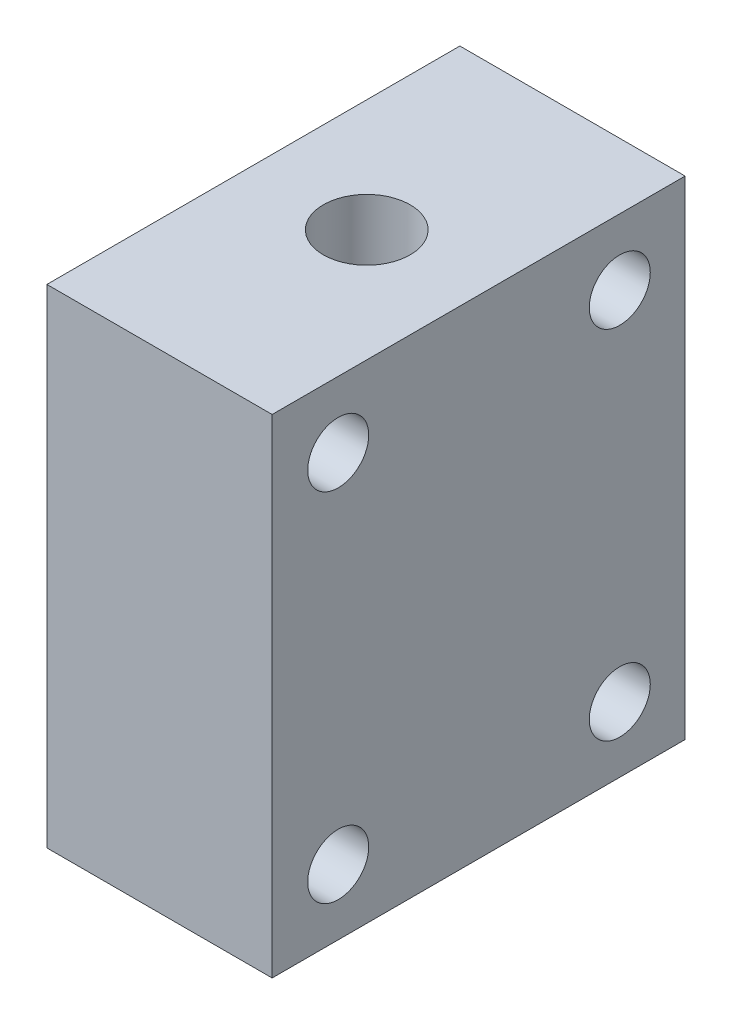
ISO-10303-21;
HEADER;
FILE_DESCRIPTION(('STEP AP214'),'2;1');
FILE_NAME('part.step','',(''),(''),'','','');
FILE_SCHEMA(('AUTOMOTIVE_DESIGN { 1 0 10303 214 1 1 1 1 }'));
ENDSEC;
DATA;
#1=APPLICATION_CONTEXT('core data for automotive mechanical design processes');
#2=APPLICATION_PROTOCOL_DEFINITION('international standard','automotive_design',2000,#1);
#3=PRODUCT_CONTEXT('',#1,'mechanical');
#4=PRODUCT('Part','Part','',(#3));
#5=PRODUCT_RELATED_PRODUCT_CATEGORY('part','',(#4));
#6=PRODUCT_DEFINITION_FORMATION('','',#4);
#7=PRODUCT_DEFINITION_CONTEXT('part definition',#1,'design');
#8=PRODUCT_DEFINITION('design','',#6,#7);
#9=PRODUCT_DEFINITION_SHAPE('','',#8);
#10=(LENGTH_UNIT() NAMED_UNIT(*) SI_UNIT(.MILLI.,.METRE.));
#11=(NAMED_UNIT(*) PLANE_ANGLE_UNIT() SI_UNIT($,.RADIAN.));
#12=(NAMED_UNIT(*) SI_UNIT($,.STERADIAN.) SOLID_ANGLE_UNIT());
#13=UNCERTAINTY_MEASURE_WITH_UNIT(LENGTH_MEASURE(1.E-05),#10,'distance_accuracy_value','');
#14=(GEOMETRIC_REPRESENTATION_CONTEXT(3) GLOBAL_UNCERTAINTY_ASSIGNED_CONTEXT((#13)) GLOBAL_UNIT_ASSIGNED_CONTEXT((#10,
#11,#12)) REPRESENTATION_CONTEXT('',''));
#15=CARTESIAN_POINT('',(0.,0.,0.));
#16=DIRECTION('',(0.,0.,1.));
#17=DIRECTION('',(1.,0.,0.));
#18=AXIS2_PLACEMENT_3D('',#15,#16,#17);
#19=CARTESIAN_POINT('',(38.1,0.,0.));
#20=DIRECTION('',(0.,1.,0.));
#21=DIRECTION('',(0.,0.,1.));
#22=AXIS2_PLACEMENT_3D('',#19,#20,#21);
#23=PLANE('',#22);
#24=DIRECTION('',(0.,0.,-1.));
#25=VECTOR('',#24,1.);
#26=CARTESIAN_POINT('',(0.,0.,0.));
#27=LINE('',#26,#25);
#28=CARTESIAN_POINT('',(0.,0.,69.85));
#29=VERTEX_POINT('',#28);
#30=CARTESIAN_POINT('',(0.,0.,0.));
#31=VERTEX_POINT('',#30);
#32=EDGE_CURVE('E181',#29,#31,#27,.T.);
#33=ORIENTED_EDGE('',*,*,#32,.T.);
#34=DIRECTION('',(-1.,0.,0.));
#35=VECTOR('',#34,1.);
#36=CARTESIAN_POINT('',(38.1,0.,0.));
#37=LINE('',#36,#35);
#38=CARTESIAN_POINT('',(38.1,0.,0.));
#39=VERTEX_POINT('',#38);
#40=EDGE_CURVE('E210',#39,#31,#37,.T.);
#41=ORIENTED_EDGE('',*,*,#40,.F.);
#42=DIRECTION('',(0.,0.,-1.));
#43=VECTOR('',#42,1.);
#44=CARTESIAN_POINT('',(38.1,0.,0.));
#45=LINE('',#44,#43);
#46=CARTESIAN_POINT('',(38.1,0.,69.85));
#47=VERTEX_POINT('',#46);
#48=EDGE_CURVE('E184',#47,#39,#45,.T.);
#49=ORIENTED_EDGE('',*,*,#48,.F.);
#50=DIRECTION('',(-1.,0.,0.));
#51=VECTOR('',#50,1.);
#52=CARTESIAN_POINT('',(38.1,0.,69.85));
#53=LINE('',#52,#51);
#54=EDGE_CURVE('E194',#47,#29,#53,.T.);
#55=ORIENTED_EDGE('',*,*,#54,.T.);
#56=EDGE_LOOP('',(#33,#41,#49,#55));
#57=FACE_BOUND('',#56,.T.);
#58=ADVANCED_FACE('F43',(#57),#23,.F.);
#59=CARTESIAN_POINT('',(38.1,0.,0.));
#60=DIRECTION('',(0.,0.,1.));
#61=DIRECTION('',(1.,0.,0.));
#62=AXIS2_PLACEMENT_3D('',#59,#60,#61);
#63=PLANE('',#62);
#64=DIRECTION('',(0.,1.,0.));
#65=VECTOR('',#64,1.);
#66=CARTESIAN_POINT('',(0.,0.,0.));
#67=LINE('',#66,#65);
#68=CARTESIAN_POINT('',(0.,82.55,0.));
#69=VERTEX_POINT('',#68);
#70=EDGE_CURVE('E197',#31,#69,#67,.T.);
#71=ORIENTED_EDGE('',*,*,#70,.T.);
#72=DIRECTION('',(-1.,0.,0.));
#73=VECTOR('',#72,1.);
#74=CARTESIAN_POINT('',(38.1,82.55,0.));
#75=LINE('',#74,#73);
#76=CARTESIAN_POINT('',(38.1,82.55,0.));
#77=VERTEX_POINT('',#76);
#78=EDGE_CURVE('E207',#77,#69,#75,.T.);
#79=ORIENTED_EDGE('',*,*,#78,.F.);
#80=DIRECTION('',(0.,1.,0.));
#81=VECTOR('',#80,1.);
#82=CARTESIAN_POINT('',(38.1,0.,0.));
#83=LINE('',#82,#81);
#84=EDGE_CURVE('E187',#39,#77,#83,.T.);
#85=ORIENTED_EDGE('',*,*,#84,.F.);
#86=ORIENTED_EDGE('',*,*,#40,.T.);
#87=EDGE_LOOP('',(#71,#79,#85,#86));
#88=FACE_BOUND('',#87,.T.);
#89=ADVANCED_FACE('F237',(#88),#63,.F.);
#90=CARTESIAN_POINT('',(38.1,82.55,0.));
#91=DIRECTION('',(0.,-1.,0.));
#92=DIRECTION('',(0.,0.,-1.));
#93=AXIS2_PLACEMENT_3D('',#90,#91,#92);
#94=PLANE('',#93);
#95=CARTESIAN_POINT('',(19.05,82.55,34.798));
#96=DIRECTION('',(0.,1.,0.));
#97=DIRECTION('',(0.,0.,1.));
#98=AXIS2_PLACEMENT_3D('',#95,#96,#97);
#99=CIRCLE('',#98,7.3421875);
#100=CARTESIAN_POINT('',(19.05,82.55,42.1401875));
#101=VERTEX_POINT('',#100);
#102=EDGE_CURVE('E227',#101,#101,#99,.T.);
#103=ORIENTED_EDGE('',*,*,#102,.F.);
#104=EDGE_LOOP('',(#103));
#105=FACE_BOUND('',#104,.T.);
#106=DIRECTION('',(0.,0.,1.));
#107=VECTOR('',#106,1.);
#108=CARTESIAN_POINT('',(0.,82.55,0.));
#109=LINE('',#108,#107);
#110=CARTESIAN_POINT('',(0.,82.55,69.85));
#111=VERTEX_POINT('',#110);
#112=EDGE_CURVE('E199',#69,#111,#109,.T.);
#113=ORIENTED_EDGE('',*,*,#112,.T.);
#114=DIRECTION('',(-1.,0.,0.));
#115=VECTOR('',#114,1.);
#116=CARTESIAN_POINT('',(38.1,82.55,69.85));
#117=LINE('',#116,#115);
#118=CARTESIAN_POINT('',(38.1,82.55,69.85));
#119=VERTEX_POINT('',#118);
#120=EDGE_CURVE('E204',#119,#111,#117,.T.);
#121=ORIENTED_EDGE('',*,*,#120,.F.);
#122=DIRECTION('',(0.,0.,1.));
#123=VECTOR('',#122,1.);
#124=CARTESIAN_POINT('',(38.1,82.55,0.));
#125=LINE('',#124,#123);
#126=EDGE_CURVE('E190',#77,#119,#125,.T.);
#127=ORIENTED_EDGE('',*,*,#126,.F.);
#128=ORIENTED_EDGE('',*,*,#78,.T.);
#129=EDGE_LOOP('',(#113,#121,#127,#128));
#130=FACE_BOUND('',#129,.T.);
#131=ADVANCED_FACE('F233',(#105,#130),#94,.F.);
#132=CARTESIAN_POINT('',(38.1,0.,69.85));
#133=DIRECTION('',(0.,0.,-1.));
#134=DIRECTION('',(-1.,0.,0.));
#135=AXIS2_PLACEMENT_3D('',#132,#133,#134);
#136=PLANE('',#135);
#137=DIRECTION('',(0.,-1.,0.));
#138=VECTOR('',#137,1.);
#139=CARTESIAN_POINT('',(0.,0.,69.85));
#140=LINE('',#139,#138);
#141=EDGE_CURVE('E188',#111,#29,#140,.T.);
#142=ORIENTED_EDGE('',*,*,#141,.T.);
#143=ORIENTED_EDGE('',*,*,#54,.F.);
#144=DIRECTION('',(0.,-1.,0.));
#145=VECTOR('',#144,1.);
#146=CARTESIAN_POINT('',(38.1,0.,69.85));
#147=LINE('',#146,#145);
#148=EDGE_CURVE('E192',#119,#47,#147,.T.);
#149=ORIENTED_EDGE('',*,*,#148,.F.);
#150=ORIENTED_EDGE('',*,*,#120,.T.);
#151=EDGE_LOOP('',(#142,#143,#149,#150));
#152=FACE_BOUND('',#151,.T.);
#153=ADVANCED_FACE('F236',(#152),#136,.F.);
#154=CARTESIAN_POINT('',(38.1,0.,0.));
#155=DIRECTION('',(-1.,0.,0.));
#156=DIRECTION('',(0.,0.,1.));
#157=AXIS2_PLACEMENT_3D('',#154,#155,#156);
#158=PLANE('',#157);
#159=CARTESIAN_POINT('',(38.1,71.374,11.049));
#160=DIRECTION('',(1.,0.,0.));
#161=DIRECTION('',(0.,0.,-1.));
#162=AXIS2_PLACEMENT_3D('',#159,#160,#161);
#163=CIRCLE('',#162,5.15937499999999);
#164=CARTESIAN_POINT('',(38.1,71.374,5.88962500000001));
#165=VERTEX_POINT('',#164);
#166=EDGE_CURVE('E160',#165,#165,#163,.T.);
#167=ORIENTED_EDGE('',*,*,#166,.F.);
#168=EDGE_LOOP('',(#167));
#169=FACE_BOUND('',#168,.T.);
#170=CARTESIAN_POINT('',(38.1,11.049,58.674));
#171=DIRECTION('',(1.,0.,0.));
#172=DIRECTION('',(0.,0.,-1.));
#173=AXIS2_PLACEMENT_3D('',#170,#171,#172);
#174=CIRCLE('',#173,5.159375);
#175=CARTESIAN_POINT('',(38.1,11.049,53.514625));
#176=VERTEX_POINT('',#175);
#177=EDGE_CURVE('E170',#176,#176,#174,.T.);
#178=ORIENTED_EDGE('',*,*,#177,.F.);
#179=EDGE_LOOP('',(#178));
#180=FACE_BOUND('',#179,.T.);
#181=CARTESIAN_POINT('',(38.1,71.374,58.674));
#182=DIRECTION('',(1.,0.,0.));
#183=DIRECTION('',(0.,0.,-1.));
#184=AXIS2_PLACEMENT_3D('',#181,#182,#183);
#185=CIRCLE('',#184,5.15937499999999);
#186=CARTESIAN_POINT('',(38.1,71.374,53.514625));
#187=VERTEX_POINT('',#186);
#188=EDGE_CURVE('E159',#187,#187,#185,.T.);
#189=ORIENTED_EDGE('',*,*,#188,.F.);
#190=EDGE_LOOP('',(#189));
#191=FACE_BOUND('',#190,.T.);
#192=CARTESIAN_POINT('',(38.1,11.049,11.049));
#193=DIRECTION('',(1.,0.,0.));
#194=DIRECTION('',(0.,0.,-1.));
#195=AXIS2_PLACEMENT_3D('',#192,#193,#194);
#196=CIRCLE('',#195,5.159375);
#197=CARTESIAN_POINT('',(38.1,11.049,5.889625));
#198=VERTEX_POINT('',#197);
#199=EDGE_CURVE('E178',#198,#198,#196,.T.);
#200=ORIENTED_EDGE('',*,*,#199,.F.);
#201=EDGE_LOOP('',(#200));
#202=FACE_BOUND('',#201,.T.);
#203=ORIENTED_EDGE('',*,*,#48,.T.);
#204=ORIENTED_EDGE('',*,*,#84,.T.);
#205=ORIENTED_EDGE('',*,*,#126,.T.);
#206=ORIENTED_EDGE('',*,*,#148,.T.);
#207=EDGE_LOOP('',(#203,#204,#205,#206));
#208=FACE_BOUND('',#207,.T.);
#209=ADVANCED_FACE('F254',(#169,#180,#191,#202,#208),#158,.F.);
#210=CARTESIAN_POINT('',(0.,0.,0.));
#211=DIRECTION('',(-1.,0.,0.));
#212=DIRECTION('',(0.,0.,1.));
#213=AXIS2_PLACEMENT_3D('',#210,#211,#212);
#214=PLANE('',#213);
#215=CARTESIAN_POINT('',(0.,58.674,34.798));
#216=DIRECTION('',(1.,0.,0.));
#217=DIRECTION('',(0.,0.,-1.));
#218=AXIS2_PLACEMENT_3D('',#215,#216,#217);
#219=CIRCLE('',#218,12.7254);
#220=CARTESIAN_POINT('',(0.,58.674,22.0726));
#221=VERTEX_POINT('',#220);
#222=EDGE_CURVE('E136',#221,#221,#219,.T.);
#223=ORIENTED_EDGE('',*,*,#222,.T.);
#224=EDGE_LOOP('',(#223));
#225=FACE_BOUND('',#224,.T.);
#226=CARTESIAN_POINT('',(0.,23.622,34.798));
#227=DIRECTION('',(1.,0.,0.));
#228=DIRECTION('',(0.,0.,-1.));
#229=AXIS2_PLACEMENT_3D('',#226,#227,#228);
#230=CIRCLE('',#229,12.7254);
#231=CARTESIAN_POINT('',(0.,23.622,22.0726));
#232=VERTEX_POINT('',#231);
#233=EDGE_CURVE('E149',#232,#232,#230,.T.);
#234=ORIENTED_EDGE('',*,*,#233,.T.);
#235=EDGE_LOOP('',(#234));
#236=FACE_BOUND('',#235,.T.);
#237=CARTESIAN_POINT('',(0.,71.374,11.049));
#238=DIRECTION('',(1.,0.,0.));
#239=DIRECTION('',(0.,0.,-1.));
#240=AXIS2_PLACEMENT_3D('',#237,#238,#239);
#241=CIRCLE('',#240,5.15937499999999);
#242=CARTESIAN_POINT('',(0.,71.374,5.88962500000001));
#243=VERTEX_POINT('',#242);
#244=EDGE_CURVE('E164',#243,#243,#241,.T.);
#245=ORIENTED_EDGE('',*,*,#244,.T.);
#246=EDGE_LOOP('',(#245));
#247=FACE_BOUND('',#246,.T.);
#248=CARTESIAN_POINT('',(0.,11.049,58.674));
#249=DIRECTION('',(1.,0.,0.));
#250=DIRECTION('',(0.,0.,-1.));
#251=AXIS2_PLACEMENT_3D('',#248,#249,#250);
#252=CIRCLE('',#251,5.159375);
#253=CARTESIAN_POINT('',(0.,11.049,53.514625));
#254=VERTEX_POINT('',#253);
#255=EDGE_CURVE('E167',#254,#254,#252,.T.);
#256=ORIENTED_EDGE('',*,*,#255,.T.);
#257=EDGE_LOOP('',(#256));
#258=FACE_BOUND('',#257,.T.);
#259=CARTESIAN_POINT('',(0.,71.374,58.674));
#260=DIRECTION('',(1.,0.,0.));
#261=DIRECTION('',(0.,0.,-1.));
#262=AXIS2_PLACEMENT_3D('',#259,#260,#261);
#263=CIRCLE('',#262,5.15937499999999);
#264=CARTESIAN_POINT('',(0.,71.374,53.514625));
#265=VERTEX_POINT('',#264);
#266=EDGE_CURVE('E173',#265,#265,#263,.T.);
#267=ORIENTED_EDGE('',*,*,#266,.T.);
#268=EDGE_LOOP('',(#267));
#269=FACE_BOUND('',#268,.T.);
#270=CARTESIAN_POINT('',(0.,11.049,11.049));
#271=DIRECTION('',(1.,0.,0.));
#272=DIRECTION('',(0.,0.,-1.));
#273=AXIS2_PLACEMENT_3D('',#270,#271,#272);
#274=CIRCLE('',#273,5.159375);
#275=CARTESIAN_POINT('',(0.,11.049,5.889625));
#276=VERTEX_POINT('',#275);
#277=EDGE_CURVE('E163',#276,#276,#274,.T.);
#278=ORIENTED_EDGE('',*,*,#277,.T.);
#279=EDGE_LOOP('',(#278));
#280=FACE_BOUND('',#279,.T.);
#281=ORIENTED_EDGE('',*,*,#32,.F.);
#282=ORIENTED_EDGE('',*,*,#141,.F.);
#283=ORIENTED_EDGE('',*,*,#112,.F.);
#284=ORIENTED_EDGE('',*,*,#70,.F.);
#285=EDGE_LOOP('',(#281,#282,#283,#284));
#286=FACE_BOUND('',#285,.T.);
#287=ADVANCED_FACE('F249',(#225,#236,#247,#258,#269,#280,#286),#214,.T.);
#288=CARTESIAN_POINT('',(38.1,11.049,11.049));
#289=DIRECTION('',(-1.,0.,0.));
#290=DIRECTION('',(0.,0.,1.));
#291=AXIS2_PLACEMENT_3D('',#288,#289,#290);
#292=CYLINDRICAL_SURFACE('',#291,5.159375);
#293=ORIENTED_EDGE('',*,*,#199,.T.);
#294=EDGE_LOOP('',(#293));
#295=FACE_BOUND('',#294,.T.);
#296=ORIENTED_EDGE('',*,*,#277,.F.);
#297=EDGE_LOOP('',(#296));
#298=FACE_BOUND('',#297,.T.);
#299=ADVANCED_FACE('F265',(#295,#298),#292,.F.);
#300=CARTESIAN_POINT('',(38.1,71.374,58.674));
#301=DIRECTION('',(-1.,0.,0.));
#302=DIRECTION('',(0.,0.,1.));
#303=AXIS2_PLACEMENT_3D('',#300,#301,#302);
#304=CYLINDRICAL_SURFACE('',#303,5.15937499999999);
#305=ORIENTED_EDGE('',*,*,#188,.T.);
#306=EDGE_LOOP('',(#305));
#307=FACE_BOUND('',#306,.T.);
#308=ORIENTED_EDGE('',*,*,#266,.F.);
#309=EDGE_LOOP('',(#308));
#310=FACE_BOUND('',#309,.T.);
#311=ADVANCED_FACE('F271',(#307,#310),#304,.F.);
#312=CARTESIAN_POINT('',(38.1,11.049,58.674));
#313=DIRECTION('',(-1.,0.,0.));
#314=DIRECTION('',(0.,0.,1.));
#315=AXIS2_PLACEMENT_3D('',#312,#313,#314);
#316=CYLINDRICAL_SURFACE('',#315,5.159375);
#317=ORIENTED_EDGE('',*,*,#177,.T.);
#318=EDGE_LOOP('',(#317));
#319=FACE_BOUND('',#318,.T.);
#320=ORIENTED_EDGE('',*,*,#255,.F.);
#321=EDGE_LOOP('',(#320));
#322=FACE_BOUND('',#321,.T.);
#323=ADVANCED_FACE('F275',(#319,#322),#316,.F.);
#324=CARTESIAN_POINT('',(38.1,71.374,11.049));
#325=DIRECTION('',(-1.,0.,0.));
#326=DIRECTION('',(0.,0.,1.));
#327=AXIS2_PLACEMENT_3D('',#324,#325,#326);
#328=CYLINDRICAL_SURFACE('',#327,5.15937499999999);
#329=ORIENTED_EDGE('',*,*,#166,.T.);
#330=EDGE_LOOP('',(#329));
#331=FACE_BOUND('',#330,.T.);
#332=ORIENTED_EDGE('',*,*,#244,.F.);
#333=EDGE_LOOP('',(#332));
#334=FACE_BOUND('',#333,.T.);
#335=ADVANCED_FACE('F279',(#331,#334),#328,.F.);
#336=CARTESIAN_POINT('',(2.8194,23.622,34.798));
#337=DIRECTION('',(-1.,0.,0.));
#338=DIRECTION('',(0.,0.,1.));
#339=AXIS2_PLACEMENT_3D('',#336,#337,#338);
#340=CYLINDRICAL_SURFACE('',#339,12.7254);
#341=CARTESIAN_POINT('',(2.8194,23.622,34.798));
#342=DIRECTION('',(1.,0.,0.));
#343=DIRECTION('',(0.,0.,-1.));
#344=AXIS2_PLACEMENT_3D('',#341,#342,#343);
#345=CIRCLE('',#344,12.7254);
#346=CARTESIAN_POINT('',(2.8194,23.622,22.0726));
#347=VERTEX_POINT('',#346);
#348=EDGE_CURVE('E150',#347,#347,#345,.T.);
#349=ORIENTED_EDGE('',*,*,#348,.T.);
#350=EDGE_LOOP('',(#349));
#351=FACE_BOUND('',#350,.T.);
#352=ORIENTED_EDGE('',*,*,#233,.F.);
#353=EDGE_LOOP('',(#352));
#354=FACE_BOUND('',#353,.T.);
#355=ADVANCED_FACE('F283',(#351,#354),#340,.F.);
#356=CARTESIAN_POINT('',(2.8194,23.622,34.798));
#357=DIRECTION('',(1.,0.,0.));
#358=DIRECTION('',(0.,0.,-1.));
#359=AXIS2_PLACEMENT_3D('',#356,#357,#358);
#360=PLANE('',#359);
#361=CARTESIAN_POINT('',(2.8194,23.622,34.798));
#362=DIRECTION('',(1.,0.,0.));
#363=DIRECTION('',(0.,0.,-1.));
#364=AXIS2_PLACEMENT_3D('',#361,#362,#363);
#365=CIRCLE('',#364,7.3421875);
#366=CARTESIAN_POINT('',(2.8194,23.622,27.4558125));
#367=VERTEX_POINT('',#366);
#368=EDGE_CURVE('E153',#367,#367,#365,.T.);
#369=ORIENTED_EDGE('',*,*,#368,.T.);
#370=EDGE_LOOP('',(#369));
#371=FACE_BOUND('',#370,.T.);
#372=ORIENTED_EDGE('',*,*,#348,.F.);
#373=EDGE_LOOP('',(#372));
#374=FACE_BOUND('',#373,.T.);
#375=ADVANCED_FACE('F291',(#371,#374),#360,.F.);
#376=CARTESIAN_POINT('',(28.448,23.622,34.798));
#377=DIRECTION('',(1.,0.,0.));
#378=DIRECTION('',(0.,0.,-1.));
#379=AXIS2_PLACEMENT_3D('',#376,#377,#378);
#380=PLANE('',#379);
#381=CARTESIAN_POINT('',(28.448,23.622,34.798));
#382=DIRECTION('',(1.,0.,0.));
#383=DIRECTION('',(0.,0.,-1.));
#384=AXIS2_PLACEMENT_3D('',#381,#382,#383);
#385=CIRCLE('',#384,7.3421875);
#386=CARTESIAN_POINT('',(28.448,23.622,27.4558125));
#387=VERTEX_POINT('',#386);
#388=EDGE_CURVE('E156',#387,#387,#385,.T.);
#389=ORIENTED_EDGE('',*,*,#388,.F.);
#390=EDGE_LOOP('',(#389));
#391=FACE_BOUND('',#390,.T.);
#392=ADVANCED_FACE('F288',(#391),#380,.F.);
#393=CARTESIAN_POINT('',(28.448,23.622,34.798));
#394=DIRECTION('',(-1.,0.,0.));
#395=DIRECTION('',(0.,0.,1.));
#396=AXIS2_PLACEMENT_3D('',#393,#394,#395);
#397=CYLINDRICAL_SURFACE('',#396,7.3421875);
#398=CARTESIAN_POINT('',(19.05,23.622,34.798));
#399=DIRECTION('',(-0.707106781186547,-0.707106781186547,0.));
#400=DIRECTION('',(-0.707106781186547,0.707106781186547,0.));
#401=AXIS2_PLACEMENT_3D('',#398,#399,#400);
#402=ELLIPSE('',#401,10.3834211399862,7.3421875);
#403=CARTESIAN_POINT('',(20.574,22.098,27.6157203281161));
#404=VERTEX_POINT('',#403);
#405=CARTESIAN_POINT('',(19.05,23.622,27.4558125));
#406=VERTEX_POINT('',#405);
#407=EDGE_CURVE('E57',#404,#406,#402,.F.);
#408=ORIENTED_EDGE('',*,*,#407,.F.);
#409=DIRECTION('',(-1.,0.,0.));
#410=VECTOR('',#409,1.);
#411=CARTESIAN_POINT('',(28.448,22.098,27.6157203281161));
#412=LINE('',#411,#410);
#413=CARTESIAN_POINT('',(17.526,22.098,27.6157203281161));
#414=VERTEX_POINT('',#413);
#415=EDGE_CURVE('E11',#404,#414,#412,.T.);
#416=ORIENTED_EDGE('',*,*,#415,.T.);
#417=CARTESIAN_POINT('',(19.05,23.622,34.798));
#418=DIRECTION('',(-0.707106781186547,0.707106781186547,0.));
#419=DIRECTION('',(-0.707106781186547,-0.707106781186547,0.));
#420=AXIS2_PLACEMENT_3D('',#417,#418,#419);
#421=ELLIPSE('',#420,10.3834211399862,7.3421875);
#422=EDGE_CURVE('E113',#406,#414,#421,.T.);
#423=ORIENTED_EDGE('',*,*,#422,.F.);
#424=CARTESIAN_POINT('',(19.05,23.622,34.798));
#425=DIRECTION('',(-0.707106781186547,-0.707106781186547,0.));
#426=DIRECTION('',(-0.707106781186547,0.707106781186547,0.));
#427=AXIS2_PLACEMENT_3D('',#424,#425,#426);
#428=ELLIPSE('',#427,10.3834211399862,7.3421875);
#429=CARTESIAN_POINT('',(19.05,23.622,42.1401875));
#430=VERTEX_POINT('',#429);
#431=EDGE_CURVE('E121',#430,#406,#428,.T.);
#432=ORIENTED_EDGE('',*,*,#431,.F.);
#433=CARTESIAN_POINT('',(17.526,22.098,41.9802796718839));
#434=VERTEX_POINT('',#433);
#435=EDGE_CURVE('E124',#434,#430,#421,.T.);
#436=ORIENTED_EDGE('',*,*,#435,.F.);
#437=DIRECTION('',(-1.,0.,0.));
#438=VECTOR('',#437,1.);
#439=CARTESIAN_POINT('',(28.448,22.098,41.9802796718839));
#440=LINE('',#439,#438);
#441=CARTESIAN_POINT('',(20.574,22.098,41.9802796718839));
#442=VERTEX_POINT('',#441);
#443=EDGE_CURVE('E50',#434,#442,#440,.F.);
#444=ORIENTED_EDGE('',*,*,#443,.T.);
#445=EDGE_CURVE('E123',#430,#442,#402,.F.);
#446=ORIENTED_EDGE('',*,*,#445,.F.);
#447=CARTESIAN_POINT('',(19.05,23.622,34.798));
#448=DIRECTION('',(-0.707106781186547,0.707106781186547,0.));
#449=DIRECTION('',(-0.707106781186547,-0.707106781186547,0.));
#450=AXIS2_PLACEMENT_3D('',#447,#448,#449);
#451=ELLIPSE('',#450,10.3834211399862,7.3421875);
#452=EDGE_CURVE('E120',#406,#430,#451,.F.);
#453=ORIENTED_EDGE('',*,*,#452,.F.);
#454=EDGE_LOOP('',(#408,#416,#423,#432,#436,#444,#446,#453));
#455=FACE_BOUND('',#454,.T.);
#456=ORIENTED_EDGE('',*,*,#368,.F.);
#457=EDGE_LOOP('',(#456));
#458=FACE_BOUND('',#457,.T.);
#459=ORIENTED_EDGE('',*,*,#388,.T.);
#460=EDGE_LOOP('',(#459));
#461=FACE_BOUND('',#460,.T.);
#462=ADVANCED_FACE('F117',(#455,#458,#461),#397,.F.);
#463=CARTESIAN_POINT('',(2.8194,58.674,34.798));
#464=DIRECTION('',(-1.,0.,0.));
#465=DIRECTION('',(0.,0.,1.));
#466=AXIS2_PLACEMENT_3D('',#463,#464,#465);
#467=CYLINDRICAL_SURFACE('',#466,12.7254);
#468=CARTESIAN_POINT('',(2.8194,58.674,34.798));
#469=DIRECTION('',(1.,0.,0.));
#470=DIRECTION('',(0.,0.,-1.));
#471=AXIS2_PLACEMENT_3D('',#468,#469,#470);
#472=CIRCLE('',#471,12.7254);
#473=CARTESIAN_POINT('',(2.8194,58.674,22.0726));
#474=VERTEX_POINT('',#473);
#475=EDGE_CURVE('E138',#474,#474,#472,.T.);
#476=ORIENTED_EDGE('',*,*,#475,.T.);
#477=EDGE_LOOP('',(#476));
#478=FACE_BOUND('',#477,.T.);
#479=ORIENTED_EDGE('',*,*,#222,.F.);
#480=EDGE_LOOP('',(#479));
#481=FACE_BOUND('',#480,.T.);
#482=ADVANCED_FACE('F287',(#478,#481),#467,.F.);
#483=CARTESIAN_POINT('',(2.8194,58.674,34.798));
#484=DIRECTION('',(1.,0.,0.));
#485=DIRECTION('',(0.,0.,-1.));
#486=AXIS2_PLACEMENT_3D('',#483,#484,#485);
#487=PLANE('',#486);
#488=CARTESIAN_POINT('',(2.8194,58.674,34.798));
#489=DIRECTION('',(1.,0.,0.));
#490=DIRECTION('',(0.,0.,-1.));
#491=AXIS2_PLACEMENT_3D('',#488,#489,#490);
#492=CIRCLE('',#491,7.3421875);
#493=CARTESIAN_POINT('',(2.8194,58.674,27.4558125));
#494=VERTEX_POINT('',#493);
#495=EDGE_CURVE('E143',#494,#494,#492,.T.);
#496=ORIENTED_EDGE('',*,*,#495,.T.);
#497=EDGE_LOOP('',(#496));
#498=FACE_BOUND('',#497,.T.);
#499=ORIENTED_EDGE('',*,*,#475,.F.);
#500=EDGE_LOOP('',(#499));
#501=FACE_BOUND('',#500,.T.);
#502=ADVANCED_FACE('F303',(#498,#501),#487,.F.);
#503=CARTESIAN_POINT('',(28.448,58.674,34.798));
#504=DIRECTION('',(-1.,0.,0.));
#505=DIRECTION('',(0.,0.,1.));
#506=AXIS2_PLACEMENT_3D('',#503,#504,#505);
#507=CYLINDRICAL_SURFACE('',#506,7.3421875);
#508=CARTESIAN_POINT('',(19.05,58.674,34.798));
#509=DIRECTION('',(-0.707106781186547,0.707106781186547,0.));
#510=DIRECTION('',(-0.707106781186547,-0.707106781186547,0.));
#511=AXIS2_PLACEMENT_3D('',#508,#509,#510);
#512=ELLIPSE('',#511,10.3834211399862,7.3421875);
#513=CARTESIAN_POINT('',(19.05,58.674,27.4558125));
#514=VERTEX_POINT('',#513);
#515=CARTESIAN_POINT('',(19.05,58.674,42.1401875));
#516=VERTEX_POINT('',#515);
#517=EDGE_CURVE('E220',#514,#516,#512,.T.);
#518=ORIENTED_EDGE('',*,*,#517,.F.);
#519=CARTESIAN_POINT('',(19.05,58.674,34.798));
#520=DIRECTION('',(-0.707106781186547,-0.707106781186547,0.));
#521=DIRECTION('',(-0.707106781186547,0.707106781186547,0.));
#522=AXIS2_PLACEMENT_3D('',#519,#520,#521);
#523=ELLIPSE('',#522,10.3834211399862,7.3421875);
#524=EDGE_CURVE('E218',#516,#514,#523,.T.);
#525=ORIENTED_EDGE('',*,*,#524,.F.);
#526=EDGE_LOOP('',(#518,#525));
#527=FACE_BOUND('',#526,.T.);
#528=ORIENTED_EDGE('',*,*,#495,.F.);
#529=EDGE_LOOP('',(#528));
#530=FACE_BOUND('',#529,.T.);
#531=ADVANCED_FACE('F299',(#527,#530),#507,.F.);
#532=CARTESIAN_POINT('',(19.05,22.098,34.798));
#533=DIRECTION('',(0.,1.,0.));
#534=DIRECTION('',(0.,0.,1.));
#535=AXIS2_PLACEMENT_3D('',#532,#533,#534);
#536=CYLINDRICAL_SURFACE('',#535,7.3421875);
#537=ORIENTED_EDGE('',*,*,#452,.T.);
#538=ORIENTED_EDGE('',*,*,#431,.T.);
#539=EDGE_LOOP('',(#537,#538));
#540=FACE_BOUND('',#539,.T.);
#541=ORIENTED_EDGE('',*,*,#517,.T.);
#542=CARTESIAN_POINT('',(19.05,58.674,34.798));
#543=DIRECTION('',(-0.707106781186547,-0.707106781186547,0.));
#544=DIRECTION('',(-0.707106781186547,0.707106781186547,0.));
#545=AXIS2_PLACEMENT_3D('',#542,#543,#544);
#546=ELLIPSE('',#545,10.3834211399862,7.3421875);
#547=EDGE_CURVE('E64',#516,#514,#546,.F.);
#548=ORIENTED_EDGE('',*,*,#547,.T.);
#549=EDGE_LOOP('',(#541,#548));
#550=FACE_BOUND('',#549,.T.);
#551=ADVANCED_FACE('F302',(#540,#550),#536,.F.);
#552=CARTESIAN_POINT('',(19.05,58.674,34.798));
#553=DIRECTION('',(-0.707106781186547,0.707106781186547,0.));
#554=DIRECTION('',(-0.707106781186547,-0.707106781186547,0.));
#555=AXIS2_PLACEMENT_3D('',#552,#553,#554);
#556=ELLIPSE('',#555,10.3834211399862,7.3421875);
#557=EDGE_CURVE('E222',#514,#516,#556,.F.);
#558=ORIENTED_EDGE('',*,*,#557,.T.);
#559=ORIENTED_EDGE('',*,*,#524,.T.);
#560=EDGE_LOOP('',(#558,#559));
#561=FACE_BOUND('',#560,.T.);
#562=ORIENTED_EDGE('',*,*,#102,.T.);
#563=EDGE_LOOP('',(#562));
#564=FACE_BOUND('',#563,.T.);
#565=ADVANCED_FACE('F231',(#561,#564),#536,.F.);
#566=CARTESIAN_POINT('',(19.05,22.098,34.798));
#567=DIRECTION('',(0.,1.,0.));
#568=DIRECTION('',(0.,0.,1.));
#569=AXIS2_PLACEMENT_3D('',#566,#567,#568);
#570=PLANE('',#569);
#571=CARTESIAN_POINT('',(19.05,22.098,34.798));
#572=DIRECTION('',(0.,1.,0.));
#573=DIRECTION('',(0.,0.,1.));
#574=AXIS2_PLACEMENT_3D('',#571,#572,#573);
#575=CIRCLE('',#574,7.3421875);
#576=EDGE_CURVE('E114',#434,#442,#575,.T.);
#577=ORIENTED_EDGE('',*,*,#576,.T.);
#578=ORIENTED_EDGE('',*,*,#443,.F.);
#579=EDGE_LOOP('',(#577,#578));
#580=FACE_BOUND('',#579,.T.);
#581=ADVANCED_FACE('F225',(#580),#570,.T.);
#582=ORIENTED_EDGE('',*,*,#445,.T.);
#583=ORIENTED_EDGE('',*,*,#576,.F.);
#584=ORIENTED_EDGE('',*,*,#435,.T.);
#585=EDGE_LOOP('',(#582,#583,#584));
#586=FACE_BOUND('',#585,.T.);
#587=ADVANCED_FACE('F226',(#586),#536,.F.);
#588=EDGE_CURVE('E109',#404,#414,#575,.T.);
#589=ORIENTED_EDGE('',*,*,#588,.T.);
#590=ORIENTED_EDGE('',*,*,#415,.F.);
#591=EDGE_LOOP('',(#589,#590));
#592=FACE_BOUND('',#591,.T.);
#593=ADVANCED_FACE('F108',(#592),#570,.T.);
#594=ORIENTED_EDGE('',*,*,#422,.T.);
#595=ORIENTED_EDGE('',*,*,#588,.F.);
#596=ORIENTED_EDGE('',*,*,#407,.T.);
#597=EDGE_LOOP('',(#594,#595,#596));
#598=FACE_BOUND('',#597,.T.);
#599=ADVANCED_FACE('F112',(#598),#536,.F.);
#600=CARTESIAN_POINT('',(28.448,58.674,34.798));
#601=DIRECTION('',(1.,0.,0.));
#602=DIRECTION('',(0.,0.,-1.));
#603=AXIS2_PLACEMENT_3D('',#600,#601,#602);
#604=PLANE('',#603);
#605=CARTESIAN_POINT('',(28.448,58.674,34.798));
#606=DIRECTION('',(1.,0.,0.));
#607=DIRECTION('',(0.,0.,-1.));
#608=AXIS2_PLACEMENT_3D('',#605,#606,#607);
#609=CIRCLE('',#608,7.3421875);
#610=CARTESIAN_POINT('',(28.448,58.674,27.4558125));
#611=VERTEX_POINT('',#610);
#612=EDGE_CURVE('E146',#611,#611,#609,.T.);
#613=ORIENTED_EDGE('',*,*,#612,.F.);
#614=EDGE_LOOP('',(#613));
#615=FACE_BOUND('',#614,.T.);
#616=ADVANCED_FACE('F306',(#615),#604,.F.);
#617=ORIENTED_EDGE('',*,*,#557,.F.);
#618=ORIENTED_EDGE('',*,*,#547,.F.);
#619=EDGE_LOOP('',(#617,#618));
#620=FACE_BOUND('',#619,.T.);
#621=ORIENTED_EDGE('',*,*,#612,.T.);
#622=EDGE_LOOP('',(#621));
#623=FACE_BOUND('',#622,.T.);
#624=ADVANCED_FACE('F305',(#620,#623),#507,.F.);
#625=CLOSED_SHELL('',(#58,#89,#131,#153,#209,#287,#299,#311,#323,#335,#355,#375,#392,#462,#482,
#502,#531,#551,#565,#581,#587,#593,#599,#616,#624));
#626=MANIFOLD_SOLID_BREP('B2',#625);
#627=ADVANCED_BREP_SHAPE_REPRESENTATION('',(#18,#626),#14);
#628=SHAPE_DEFINITION_REPRESENTATION(#9,#627);
ENDSEC;
END-ISO-10303-21;
